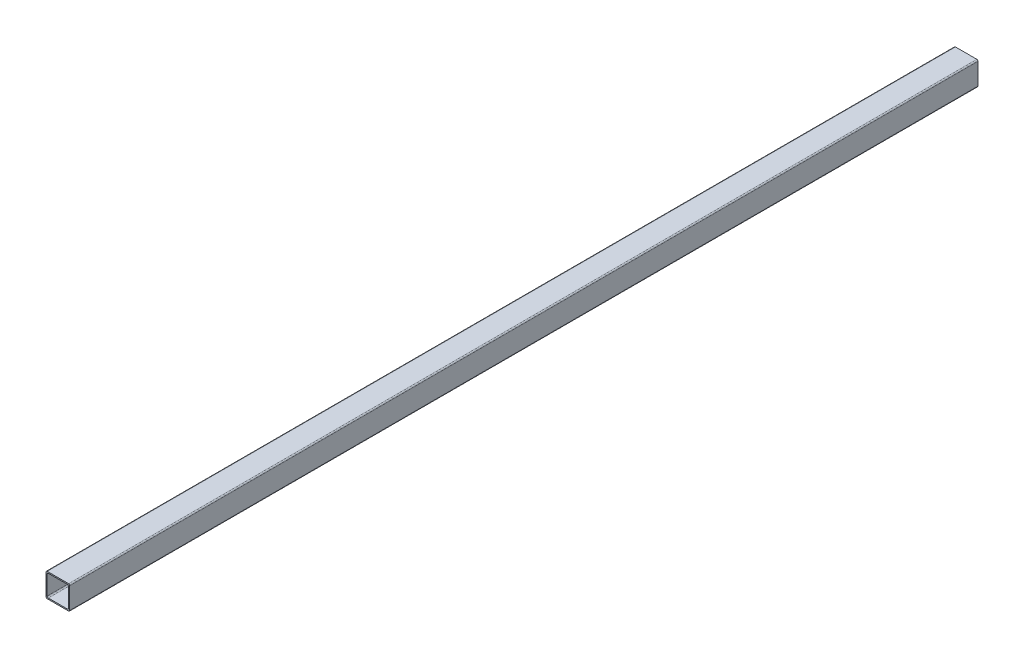
ISO-10303-21;
HEADER;
FILE_DESCRIPTION(('STEP AP214'),'2;1');
FILE_NAME('part.step','',(''),(''),'','','');
FILE_SCHEMA(('AUTOMOTIVE_DESIGN { 1 0 10303 214 1 1 1 1 }'));
ENDSEC;
DATA;
#1=APPLICATION_CONTEXT('core data for automotive mechanical design processes');
#2=APPLICATION_PROTOCOL_DEFINITION('international standard','automotive_design',2000,#1);
#3=PRODUCT_CONTEXT('',#1,'mechanical');
#4=PRODUCT('Part','Part','',(#3));
#5=PRODUCT_RELATED_PRODUCT_CATEGORY('part','',(#4));
#6=PRODUCT_DEFINITION_FORMATION('','',#4);
#7=PRODUCT_DEFINITION_CONTEXT('part definition',#1,'design');
#8=PRODUCT_DEFINITION('design','',#6,#7);
#9=PRODUCT_DEFINITION_SHAPE('','',#8);
#10=(LENGTH_UNIT() NAMED_UNIT(*) SI_UNIT(.MILLI.,.METRE.));
#11=(NAMED_UNIT(*) PLANE_ANGLE_UNIT() SI_UNIT($,.RADIAN.));
#12=(NAMED_UNIT(*) SI_UNIT($,.STERADIAN.) SOLID_ANGLE_UNIT());
#13=UNCERTAINTY_MEASURE_WITH_UNIT(LENGTH_MEASURE(1.E-05),#10,'distance_accuracy_value','');
#14=(GEOMETRIC_REPRESENTATION_CONTEXT(3) GLOBAL_UNCERTAINTY_ASSIGNED_CONTEXT((#13)) GLOBAL_UNIT_ASSIGNED_CONTEXT((#10,
#11,#12)) REPRESENTATION_CONTEXT('',''));
#15=CARTESIAN_POINT('',(0.,0.,0.));
#16=DIRECTION('',(0.,0.,1.));
#17=DIRECTION('',(1.,0.,0.));
#18=AXIS2_PLACEMENT_3D('',#15,#16,#17);
#19=CARTESIAN_POINT('',(18.,18.,1530.));
#20=DIRECTION('',(0.,0.,-1.));
#21=DIRECTION('',(-1.,0.,0.));
#22=AXIS2_PLACEMENT_3D('',#19,#20,#21);
#23=PLANE('',#22);
#24=CARTESIAN_POINT('',(18.,18.,1530.));
#25=DIRECTION('',(0.,0.,1.));
#26=DIRECTION('',(-1.,0.,0.));
#27=AXIS2_PLACEMENT_3D('',#24,#25,#26);
#28=CIRCLE('',#27,2.);
#29=CARTESIAN_POINT('',(20.,18.,1530.));
#30=VERTEX_POINT('',#29);
#31=CARTESIAN_POINT('',(18.,20.,1530.));
#32=VERTEX_POINT('',#31);
#33=EDGE_CURVE('E213',#30,#32,#28,.T.);
#34=ORIENTED_EDGE('',*,*,#33,.T.);
#35=DIRECTION('',(-1.,0.,0.));
#36=VECTOR('',#35,1.);
#37=CARTESIAN_POINT('',(-18.,20.,1530.));
#38=LINE('',#37,#36);
#39=CARTESIAN_POINT('',(-18.,20.,1530.));
#40=VERTEX_POINT('',#39);
#41=EDGE_CURVE('E216',#32,#40,#38,.T.);
#42=ORIENTED_EDGE('',*,*,#41,.T.);
#43=CARTESIAN_POINT('',(-18.,18.,1530.));
#44=DIRECTION('',(0.,0.,1.));
#45=DIRECTION('',(1.,0.,0.));
#46=AXIS2_PLACEMENT_3D('',#43,#44,#45);
#47=CIRCLE('',#46,2.);
#48=CARTESIAN_POINT('',(-20.,18.,1530.));
#49=VERTEX_POINT('',#48);
#50=EDGE_CURVE('E219',#40,#49,#47,.T.);
#51=ORIENTED_EDGE('',*,*,#50,.T.);
#52=DIRECTION('',(0.,-1.,0.));
#53=VECTOR('',#52,1.);
#54=CARTESIAN_POINT('',(-20.,18.,1530.));
#55=LINE('',#54,#53);
#56=CARTESIAN_POINT('',(-20.,-18.,1530.));
#57=VERTEX_POINT('',#56);
#58=EDGE_CURVE('E221',#49,#57,#55,.T.);
#59=ORIENTED_EDGE('',*,*,#58,.T.);
#60=CARTESIAN_POINT('',(-18.,-18.,1530.));
#61=DIRECTION('',(0.,0.,1.));
#62=DIRECTION('',(1.,0.,0.));
#63=AXIS2_PLACEMENT_3D('',#60,#61,#62);
#64=CIRCLE('',#63,2.);
#65=CARTESIAN_POINT('',(-18.,-20.,1530.));
#66=VERTEX_POINT('',#65);
#67=EDGE_CURVE('E223',#57,#66,#64,.T.);
#68=ORIENTED_EDGE('',*,*,#67,.T.);
#69=DIRECTION('',(1.,0.,0.));
#70=VECTOR('',#69,1.);
#71=CARTESIAN_POINT('',(-18.,-20.,1530.));
#72=LINE('',#71,#70);
#73=CARTESIAN_POINT('',(18.,-20.,1530.));
#74=VERTEX_POINT('',#73);
#75=EDGE_CURVE('E225',#66,#74,#72,.T.);
#76=ORIENTED_EDGE('',*,*,#75,.T.);
#77=CARTESIAN_POINT('',(18.,-18.,1530.));
#78=DIRECTION('',(0.,0.,1.));
#79=DIRECTION('',(1.,0.,0.));
#80=AXIS2_PLACEMENT_3D('',#77,#78,#79);
#81=CIRCLE('',#80,2.);
#82=CARTESIAN_POINT('',(20.,-18.,1530.));
#83=VERTEX_POINT('',#82);
#84=EDGE_CURVE('E227',#74,#83,#81,.T.);
#85=ORIENTED_EDGE('',*,*,#84,.T.);
#86=DIRECTION('',(0.,1.,0.));
#87=VECTOR('',#86,1.);
#88=CARTESIAN_POINT('',(20.,18.,1530.));
#89=LINE('',#88,#87);
#90=EDGE_CURVE('E229',#83,#30,#89,.T.);
#91=ORIENTED_EDGE('',*,*,#90,.T.);
#92=EDGE_LOOP('',(#34,#42,#51,#59,#68,#76,#85,#91));
#93=FACE_BOUND('',#92,.T.);
#94=CARTESIAN_POINT('',(16.,16.,1530.));
#95=DIRECTION('',(0.,0.,1.));
#96=DIRECTION('',(1.,0.,0.));
#97=AXIS2_PLACEMENT_3D('',#94,#95,#96);
#98=CIRCLE('',#97,2.);
#99=CARTESIAN_POINT('',(18.,16.,1530.));
#100=VERTEX_POINT('',#99);
#101=CARTESIAN_POINT('',(16.,18.,1530.));
#102=VERTEX_POINT('',#101);
#103=EDGE_CURVE('E148',#100,#102,#98,.T.);
#104=ORIENTED_EDGE('',*,*,#103,.F.);
#105=DIRECTION('',(0.,1.,0.));
#106=VECTOR('',#105,1.);
#107=CARTESIAN_POINT('',(18.,-16.,1530.));
#108=LINE('',#107,#106);
#109=CARTESIAN_POINT('',(18.,-16.,1530.));
#110=VERTEX_POINT('',#109);
#111=EDGE_CURVE('E181',#110,#100,#108,.T.);
#112=ORIENTED_EDGE('',*,*,#111,.F.);
#113=CARTESIAN_POINT('',(16.,-16.,1530.));
#114=DIRECTION('',(0.,0.,1.));
#115=DIRECTION('',(1.,0.,0.));
#116=AXIS2_PLACEMENT_3D('',#113,#114,#115);
#117=CIRCLE('',#116,2.);
#118=CARTESIAN_POINT('',(16.,-18.,1530.));
#119=VERTEX_POINT('',#118);
#120=EDGE_CURVE('E179',#119,#110,#117,.T.);
#121=ORIENTED_EDGE('',*,*,#120,.F.);
#122=DIRECTION('',(1.,0.,0.));
#123=VECTOR('',#122,1.);
#124=CARTESIAN_POINT('',(16.,-18.,1530.));
#125=LINE('',#124,#123);
#126=CARTESIAN_POINT('',(-16.,-18.,1530.));
#127=VERTEX_POINT('',#126);
#128=EDGE_CURVE('E177',#127,#119,#125,.T.);
#129=ORIENTED_EDGE('',*,*,#128,.F.);
#130=CARTESIAN_POINT('',(-16.,-16.,1530.));
#131=DIRECTION('',(0.,0.,1.));
#132=DIRECTION('',(-1.,0.,0.));
#133=AXIS2_PLACEMENT_3D('',#130,#131,#132);
#134=CIRCLE('',#133,2.);
#135=CARTESIAN_POINT('',(-18.,-16.,1530.));
#136=VERTEX_POINT('',#135);
#137=EDGE_CURVE('E175',#136,#127,#134,.T.);
#138=ORIENTED_EDGE('',*,*,#137,.F.);
#139=DIRECTION('',(0.,-1.,0.));
#140=VECTOR('',#139,1.);
#141=CARTESIAN_POINT('',(-18.,-16.,1530.));
#142=LINE('',#141,#140);
#143=CARTESIAN_POINT('',(-18.,16.,1530.));
#144=VERTEX_POINT('',#143);
#145=EDGE_CURVE('E171',#144,#136,#142,.T.);
#146=ORIENTED_EDGE('',*,*,#145,.F.);
#147=CARTESIAN_POINT('',(-16.,16.,1530.));
#148=DIRECTION('',(0.,0.,1.));
#149=DIRECTION('',(1.,0.,0.));
#150=AXIS2_PLACEMENT_3D('',#147,#148,#149);
#151=CIRCLE('',#150,2.);
#152=CARTESIAN_POINT('',(-16.,18.,1530.));
#153=VERTEX_POINT('',#152);
#154=EDGE_CURVE('E169',#153,#144,#151,.T.);
#155=ORIENTED_EDGE('',*,*,#154,.F.);
#156=DIRECTION('',(-1.,0.,0.));
#157=VECTOR('',#156,1.);
#158=CARTESIAN_POINT('',(16.,18.,1530.));
#159=LINE('',#158,#157);
#160=EDGE_CURVE('E156',#102,#153,#159,.T.);
#161=ORIENTED_EDGE('',*,*,#160,.F.);
#162=EDGE_LOOP('',(#104,#112,#121,#129,#138,#146,#155,#161));
#163=FACE_BOUND('',#162,.T.);
#164=ADVANCED_FACE('F35',(#93,#163),#23,.F.);
#165=CARTESIAN_POINT('',(18.,18.,0.));
#166=DIRECTION('',(0.,0.,-1.));
#167=DIRECTION('',(-1.,0.,0.));
#168=AXIS2_PLACEMENT_3D('',#165,#166,#167);
#169=PLANE('',#168);
#170=CARTESIAN_POINT('',(18.,18.,0.));
#171=DIRECTION('',(0.,0.,1.));
#172=DIRECTION('',(-1.,0.,0.));
#173=AXIS2_PLACEMENT_3D('',#170,#171,#172);
#174=CIRCLE('',#173,2.);
#175=CARTESIAN_POINT('',(20.,18.,0.));
#176=VERTEX_POINT('',#175);
#177=CARTESIAN_POINT('',(18.,20.,0.));
#178=VERTEX_POINT('',#177);
#179=EDGE_CURVE('E164',#176,#178,#174,.T.);
#180=ORIENTED_EDGE('',*,*,#179,.F.);
#181=DIRECTION('',(0.,1.,0.));
#182=VECTOR('',#181,1.);
#183=CARTESIAN_POINT('',(20.,18.,0.));
#184=LINE('',#183,#182);
#185=CARTESIAN_POINT('',(20.,-18.,0.));
#186=VERTEX_POINT('',#185);
#187=EDGE_CURVE('E217',#186,#176,#184,.T.);
#188=ORIENTED_EDGE('',*,*,#187,.F.);
#189=CARTESIAN_POINT('',(18.,-18.,0.));
#190=DIRECTION('',(0.,0.,1.));
#191=DIRECTION('',(1.,0.,0.));
#192=AXIS2_PLACEMENT_3D('',#189,#190,#191);
#193=CIRCLE('',#192,2.);
#194=CARTESIAN_POINT('',(18.,-20.,0.));
#195=VERTEX_POINT('',#194);
#196=EDGE_CURVE('E244',#195,#186,#193,.T.);
#197=ORIENTED_EDGE('',*,*,#196,.F.);
#198=DIRECTION('',(1.,0.,0.));
#199=VECTOR('',#198,1.);
#200=CARTESIAN_POINT('',(-18.,-20.,0.));
#201=LINE('',#200,#199);
#202=CARTESIAN_POINT('',(-18.,-20.,0.));
#203=VERTEX_POINT('',#202);
#204=EDGE_CURVE('E242',#203,#195,#201,.T.);
#205=ORIENTED_EDGE('',*,*,#204,.F.);
#206=CARTESIAN_POINT('',(-18.,-18.,0.));
#207=DIRECTION('',(0.,0.,1.));
#208=DIRECTION('',(1.,0.,0.));
#209=AXIS2_PLACEMENT_3D('',#206,#207,#208);
#210=CIRCLE('',#209,2.);
#211=CARTESIAN_POINT('',(-20.,-18.,0.));
#212=VERTEX_POINT('',#211);
#213=EDGE_CURVE('E240',#212,#203,#210,.T.);
#214=ORIENTED_EDGE('',*,*,#213,.F.);
#215=DIRECTION('',(0.,-1.,0.));
#216=VECTOR('',#215,1.);
#217=CARTESIAN_POINT('',(-20.,18.,0.));
#218=LINE('',#217,#216);
#219=CARTESIAN_POINT('',(-20.,18.,0.));
#220=VERTEX_POINT('',#219);
#221=EDGE_CURVE('E238',#220,#212,#218,.T.);
#222=ORIENTED_EDGE('',*,*,#221,.F.);
#223=CARTESIAN_POINT('',(-18.,18.,0.));
#224=DIRECTION('',(0.,0.,1.));
#225=DIRECTION('',(1.,0.,0.));
#226=AXIS2_PLACEMENT_3D('',#223,#224,#225);
#227=CIRCLE('',#226,2.);
#228=CARTESIAN_POINT('',(-18.,20.,0.));
#229=VERTEX_POINT('',#228);
#230=EDGE_CURVE('E236',#229,#220,#227,.T.);
#231=ORIENTED_EDGE('',*,*,#230,.F.);
#232=DIRECTION('',(-1.,0.,0.));
#233=VECTOR('',#232,1.);
#234=CARTESIAN_POINT('',(-18.,20.,0.));
#235=LINE('',#234,#233);
#236=EDGE_CURVE('E234',#178,#229,#235,.T.);
#237=ORIENTED_EDGE('',*,*,#236,.F.);
#238=EDGE_LOOP('',(#180,#188,#197,#205,#214,#222,#231,#237));
#239=FACE_BOUND('',#238,.T.);
#240=DIRECTION('',(0.,1.,0.));
#241=VECTOR('',#240,1.);
#242=CARTESIAN_POINT('',(18.,-16.,0.));
#243=LINE('',#242,#241);
#244=CARTESIAN_POINT('',(18.,-16.,0.));
#245=VERTEX_POINT('',#244);
#246=CARTESIAN_POINT('',(18.,16.,0.));
#247=VERTEX_POINT('',#246);
#248=EDGE_CURVE('E157',#245,#247,#243,.T.);
#249=ORIENTED_EDGE('',*,*,#248,.T.);
#250=CARTESIAN_POINT('',(16.,16.,0.));
#251=DIRECTION('',(0.,0.,1.));
#252=DIRECTION('',(1.,0.,0.));
#253=AXIS2_PLACEMENT_3D('',#250,#251,#252);
#254=CIRCLE('',#253,2.);
#255=CARTESIAN_POINT('',(16.,18.,0.));
#256=VERTEX_POINT('',#255);
#257=EDGE_CURVE('E58',#247,#256,#254,.T.);
#258=ORIENTED_EDGE('',*,*,#257,.T.);
#259=DIRECTION('',(-1.,0.,0.));
#260=VECTOR('',#259,1.);
#261=CARTESIAN_POINT('',(16.,18.,0.));
#262=LINE('',#261,#260);
#263=CARTESIAN_POINT('',(-16.,18.,0.));
#264=VERTEX_POINT('',#263);
#265=EDGE_CURVE('E163',#256,#264,#262,.T.);
#266=ORIENTED_EDGE('',*,*,#265,.T.);
#267=CARTESIAN_POINT('',(-16.,16.,0.));
#268=DIRECTION('',(0.,0.,1.));
#269=DIRECTION('',(1.,0.,0.));
#270=AXIS2_PLACEMENT_3D('',#267,#268,#269);
#271=CIRCLE('',#270,2.);
#272=CARTESIAN_POINT('',(-18.,16.,0.));
#273=VERTEX_POINT('',#272);
#274=EDGE_CURVE('E185',#264,#273,#271,.T.);
#275=ORIENTED_EDGE('',*,*,#274,.T.);
#276=DIRECTION('',(0.,-1.,0.));
#277=VECTOR('',#276,1.);
#278=CARTESIAN_POINT('',(-18.,-16.,0.));
#279=LINE('',#278,#277);
#280=CARTESIAN_POINT('',(-18.,-16.,0.));
#281=VERTEX_POINT('',#280);
#282=EDGE_CURVE('E188',#273,#281,#279,.T.);
#283=ORIENTED_EDGE('',*,*,#282,.T.);
#284=CARTESIAN_POINT('',(-16.,-16.,0.));
#285=DIRECTION('',(0.,0.,1.));
#286=DIRECTION('',(-1.,0.,0.));
#287=AXIS2_PLACEMENT_3D('',#284,#285,#286);
#288=CIRCLE('',#287,2.);
#289=CARTESIAN_POINT('',(-16.,-18.,0.));
#290=VERTEX_POINT('',#289);
#291=EDGE_CURVE('E191',#281,#290,#288,.T.);
#292=ORIENTED_EDGE('',*,*,#291,.T.);
#293=DIRECTION('',(1.,0.,0.));
#294=VECTOR('',#293,1.);
#295=CARTESIAN_POINT('',(16.,-18.,0.));
#296=LINE('',#295,#294);
#297=CARTESIAN_POINT('',(16.,-18.,0.));
#298=VERTEX_POINT('',#297);
#299=EDGE_CURVE('E194',#290,#298,#296,.T.);
#300=ORIENTED_EDGE('',*,*,#299,.T.);
#301=CARTESIAN_POINT('',(16.,-16.,0.));
#302=DIRECTION('',(0.,0.,1.));
#303=DIRECTION('',(1.,0.,0.));
#304=AXIS2_PLACEMENT_3D('',#301,#302,#303);
#305=CIRCLE('',#304,2.);
#306=EDGE_CURVE('E197',#298,#245,#305,.T.);
#307=ORIENTED_EDGE('',*,*,#306,.T.);
#308=EDGE_LOOP('',(#249,#258,#266,#275,#283,#292,#300,#307));
#309=FACE_BOUND('',#308,.T.);
#310=ADVANCED_FACE('F274',(#239,#309),#169,.T.);
#311=CARTESIAN_POINT('',(18.,18.,1530.));
#312=DIRECTION('',(0.,0.,-1.));
#313=DIRECTION('',(-1.,0.,0.));
#314=AXIS2_PLACEMENT_3D('',#311,#312,#313);
#315=CYLINDRICAL_SURFACE('',#314,2.);
#316=ORIENTED_EDGE('',*,*,#179,.T.);
#317=DIRECTION('',(0.,0.,-1.));
#318=VECTOR('',#317,1.);
#319=CARTESIAN_POINT('',(18.,20.,1530.));
#320=LINE('',#319,#318);
#321=EDGE_CURVE('E11',#32,#178,#320,.T.);
#322=ORIENTED_EDGE('',*,*,#321,.F.);
#323=ORIENTED_EDGE('',*,*,#33,.F.);
#324=DIRECTION('',(0.,0.,-1.));
#325=VECTOR('',#324,1.);
#326=CARTESIAN_POINT('',(20.,18.,1530.));
#327=LINE('',#326,#325);
#328=EDGE_CURVE('E231',#30,#176,#327,.T.);
#329=ORIENTED_EDGE('',*,*,#328,.T.);
#330=EDGE_LOOP('',(#316,#322,#323,#329));
#331=FACE_BOUND('',#330,.T.);
#332=ADVANCED_FACE('F37',(#331),#315,.T.);
#333=CARTESIAN_POINT('',(-18.,20.,1530.));
#334=DIRECTION('',(0.,-1.,0.));
#335=DIRECTION('',(0.,0.,-1.));
#336=AXIS2_PLACEMENT_3D('',#333,#334,#335);
#337=PLANE('',#336);
#338=ORIENTED_EDGE('',*,*,#236,.T.);
#339=DIRECTION('',(0.,0.,-1.));
#340=VECTOR('',#339,1.);
#341=CARTESIAN_POINT('',(-18.,20.,1530.));
#342=LINE('',#341,#340);
#343=EDGE_CURVE('E43',#40,#229,#342,.T.);
#344=ORIENTED_EDGE('',*,*,#343,.F.);
#345=ORIENTED_EDGE('',*,*,#41,.F.);
#346=ORIENTED_EDGE('',*,*,#321,.T.);
#347=EDGE_LOOP('',(#338,#344,#345,#346));
#348=FACE_BOUND('',#347,.T.);
#349=ADVANCED_FACE('F291',(#348),#337,.F.);
#350=CARTESIAN_POINT('',(-18.,18.,1530.));
#351=DIRECTION('',(0.,0.,-1.));
#352=DIRECTION('',(-1.,0.,0.));
#353=AXIS2_PLACEMENT_3D('',#350,#351,#352);
#354=CYLINDRICAL_SURFACE('',#353,2.);
#355=ORIENTED_EDGE('',*,*,#230,.T.);
#356=DIRECTION('',(0.,0.,-1.));
#357=VECTOR('',#356,1.);
#358=CARTESIAN_POINT('',(-20.,18.,1530.));
#359=LINE('',#358,#357);
#360=EDGE_CURVE('E261',#49,#220,#359,.T.);
#361=ORIENTED_EDGE('',*,*,#360,.F.);
#362=ORIENTED_EDGE('',*,*,#50,.F.);
#363=ORIENTED_EDGE('',*,*,#343,.T.);
#364=EDGE_LOOP('',(#355,#361,#362,#363));
#365=FACE_BOUND('',#364,.T.);
#366=ADVANCED_FACE('F268',(#365),#354,.T.);
#367=CARTESIAN_POINT('',(-20.,18.,1530.));
#368=DIRECTION('',(1.,0.,0.));
#369=DIRECTION('',(0.,0.,-1.));
#370=AXIS2_PLACEMENT_3D('',#367,#368,#369);
#371=PLANE('',#370);
#372=ORIENTED_EDGE('',*,*,#221,.T.);
#373=DIRECTION('',(0.,0.,-1.));
#374=VECTOR('',#373,1.);
#375=CARTESIAN_POINT('',(-20.,-18.,1530.));
#376=LINE('',#375,#374);
#377=EDGE_CURVE('E258',#57,#212,#376,.T.);
#378=ORIENTED_EDGE('',*,*,#377,.F.);
#379=ORIENTED_EDGE('',*,*,#58,.F.);
#380=ORIENTED_EDGE('',*,*,#360,.T.);
#381=EDGE_LOOP('',(#372,#378,#379,#380));
#382=FACE_BOUND('',#381,.T.);
#383=ADVANCED_FACE('F280',(#382),#371,.F.);
#384=CARTESIAN_POINT('',(-18.,-18.,1530.));
#385=DIRECTION('',(0.,0.,-1.));
#386=DIRECTION('',(-1.,0.,0.));
#387=AXIS2_PLACEMENT_3D('',#384,#385,#386);
#388=CYLINDRICAL_SURFACE('',#387,2.);
#389=ORIENTED_EDGE('',*,*,#213,.T.);
#390=DIRECTION('',(0.,0.,-1.));
#391=VECTOR('',#390,1.);
#392=CARTESIAN_POINT('',(-18.,-20.,1530.));
#393=LINE('',#392,#391);
#394=EDGE_CURVE('E255',#66,#203,#393,.T.);
#395=ORIENTED_EDGE('',*,*,#394,.F.);
#396=ORIENTED_EDGE('',*,*,#67,.F.);
#397=ORIENTED_EDGE('',*,*,#377,.T.);
#398=EDGE_LOOP('',(#389,#395,#396,#397));
#399=FACE_BOUND('',#398,.T.);
#400=ADVANCED_FACE('F284',(#399),#388,.T.);
#401=CARTESIAN_POINT('',(-18.,-20.,1530.));
#402=DIRECTION('',(0.,1.,0.));
#403=DIRECTION('',(0.,0.,1.));
#404=AXIS2_PLACEMENT_3D('',#401,#402,#403);
#405=PLANE('',#404);
#406=ORIENTED_EDGE('',*,*,#204,.T.);
#407=DIRECTION('',(0.,0.,-1.));
#408=VECTOR('',#407,1.);
#409=CARTESIAN_POINT('',(18.,-20.,1530.));
#410=LINE('',#409,#408);
#411=EDGE_CURVE('E252',#74,#195,#410,.T.);
#412=ORIENTED_EDGE('',*,*,#411,.F.);
#413=ORIENTED_EDGE('',*,*,#75,.F.);
#414=ORIENTED_EDGE('',*,*,#394,.T.);
#415=EDGE_LOOP('',(#406,#412,#413,#414));
#416=FACE_BOUND('',#415,.T.);
#417=ADVANCED_FACE('F304',(#416),#405,.F.);
#418=CARTESIAN_POINT('',(18.,-18.,1530.));
#419=DIRECTION('',(0.,0.,-1.));
#420=DIRECTION('',(-1.,0.,0.));
#421=AXIS2_PLACEMENT_3D('',#418,#419,#420);
#422=CYLINDRICAL_SURFACE('',#421,2.);
#423=ORIENTED_EDGE('',*,*,#196,.T.);
#424=DIRECTION('',(0.,0.,-1.));
#425=VECTOR('',#424,1.);
#426=CARTESIAN_POINT('',(20.,-18.,1530.));
#427=LINE('',#426,#425);
#428=EDGE_CURVE('E249',#83,#186,#427,.T.);
#429=ORIENTED_EDGE('',*,*,#428,.F.);
#430=ORIENTED_EDGE('',*,*,#84,.F.);
#431=ORIENTED_EDGE('',*,*,#411,.T.);
#432=EDGE_LOOP('',(#423,#429,#430,#431));
#433=FACE_BOUND('',#432,.T.);
#434=ADVANCED_FACE('F302',(#433),#422,.T.);
#435=CARTESIAN_POINT('',(20.,18.,1530.));
#436=DIRECTION('',(-1.,0.,0.));
#437=DIRECTION('',(0.,-1.,0.));
#438=AXIS2_PLACEMENT_3D('',#435,#436,#437);
#439=PLANE('',#438);
#440=ORIENTED_EDGE('',*,*,#187,.T.);
#441=ORIENTED_EDGE('',*,*,#328,.F.);
#442=ORIENTED_EDGE('',*,*,#90,.F.);
#443=ORIENTED_EDGE('',*,*,#428,.T.);
#444=EDGE_LOOP('',(#440,#441,#442,#443));
#445=FACE_BOUND('',#444,.T.);
#446=ADVANCED_FACE('F297',(#445),#439,.F.);
#447=CARTESIAN_POINT('',(16.,16.,1530.));
#448=DIRECTION('',(0.,0.,-1.));
#449=DIRECTION('',(-1.,0.,0.));
#450=AXIS2_PLACEMENT_3D('',#447,#448,#449);
#451=CYLINDRICAL_SURFACE('',#450,2.);
#452=ORIENTED_EDGE('',*,*,#257,.F.);
#453=DIRECTION('',(0.,0.,-1.));
#454=VECTOR('',#453,1.);
#455=CARTESIAN_POINT('',(18.,16.,1530.));
#456=LINE('',#455,#454);
#457=EDGE_CURVE('E152',#100,#247,#456,.T.);
#458=ORIENTED_EDGE('',*,*,#457,.F.);
#459=ORIENTED_EDGE('',*,*,#103,.T.);
#460=DIRECTION('',(0.,0.,-1.));
#461=VECTOR('',#460,1.);
#462=CARTESIAN_POINT('',(16.,18.,1530.));
#463=LINE('',#462,#461);
#464=EDGE_CURVE('E151',#102,#256,#463,.T.);
#465=ORIENTED_EDGE('',*,*,#464,.T.);
#466=EDGE_LOOP('',(#452,#458,#459,#465));
#467=FACE_BOUND('',#466,.T.);
#468=ADVANCED_FACE('F150',(#467),#451,.F.);
#469=CARTESIAN_POINT('',(16.,18.,1530.));
#470=DIRECTION('',(0.,-1.,0.));
#471=DIRECTION('',(0.,0.,-1.));
#472=AXIS2_PLACEMENT_3D('',#469,#470,#471);
#473=PLANE('',#472);
#474=ORIENTED_EDGE('',*,*,#265,.F.);
#475=ORIENTED_EDGE('',*,*,#464,.F.);
#476=ORIENTED_EDGE('',*,*,#160,.T.);
#477=DIRECTION('',(0.,0.,-1.));
#478=VECTOR('',#477,1.);
#479=CARTESIAN_POINT('',(-16.,18.,1530.));
#480=LINE('',#479,#478);
#481=EDGE_CURVE('E165',#153,#264,#480,.T.);
#482=ORIENTED_EDGE('',*,*,#481,.T.);
#483=EDGE_LOOP('',(#474,#475,#476,#482));
#484=FACE_BOUND('',#483,.T.);
#485=ADVANCED_FACE('F160',(#484),#473,.T.);
#486=CARTESIAN_POINT('',(-16.,16.,1530.));
#487=DIRECTION('',(0.,0.,-1.));
#488=DIRECTION('',(-1.,0.,0.));
#489=AXIS2_PLACEMENT_3D('',#486,#487,#488);
#490=CYLINDRICAL_SURFACE('',#489,2.);
#491=ORIENTED_EDGE('',*,*,#274,.F.);
#492=ORIENTED_EDGE('',*,*,#481,.F.);
#493=ORIENTED_EDGE('',*,*,#154,.T.);
#494=DIRECTION('',(0.,0.,-1.));
#495=VECTOR('',#494,1.);
#496=CARTESIAN_POINT('',(-18.,16.,1530.));
#497=LINE('',#496,#495);
#498=EDGE_CURVE('E210',#144,#273,#497,.T.);
#499=ORIENTED_EDGE('',*,*,#498,.T.);
#500=EDGE_LOOP('',(#491,#492,#493,#499));
#501=FACE_BOUND('',#500,.T.);
#502=ADVANCED_FACE('F329',(#501),#490,.F.);
#503=CARTESIAN_POINT('',(-18.,-16.,1530.));
#504=DIRECTION('',(1.,0.,0.));
#505=DIRECTION('',(0.,0.,-1.));
#506=AXIS2_PLACEMENT_3D('',#503,#504,#505);
#507=PLANE('',#506);
#508=ORIENTED_EDGE('',*,*,#282,.F.);
#509=ORIENTED_EDGE('',*,*,#498,.F.);
#510=ORIENTED_EDGE('',*,*,#145,.T.);
#511=DIRECTION('',(0.,0.,-1.));
#512=VECTOR('',#511,1.);
#513=CARTESIAN_POINT('',(-18.,-16.,1530.));
#514=LINE('',#513,#512);
#515=EDGE_CURVE('E208',#136,#281,#514,.T.);
#516=ORIENTED_EDGE('',*,*,#515,.T.);
#517=EDGE_LOOP('',(#508,#509,#510,#516));
#518=FACE_BOUND('',#517,.T.);
#519=ADVANCED_FACE('F333',(#518),#507,.T.);
#520=CARTESIAN_POINT('',(-16.,-16.,1530.));
#521=DIRECTION('',(0.,0.,-1.));
#522=DIRECTION('',(-1.,0.,0.));
#523=AXIS2_PLACEMENT_3D('',#520,#521,#522);
#524=CYLINDRICAL_SURFACE('',#523,2.);
#525=ORIENTED_EDGE('',*,*,#291,.F.);
#526=ORIENTED_EDGE('',*,*,#515,.F.);
#527=ORIENTED_EDGE('',*,*,#137,.T.);
#528=DIRECTION('',(0.,0.,-1.));
#529=VECTOR('',#528,1.);
#530=CARTESIAN_POINT('',(-16.,-18.,1530.));
#531=LINE('',#530,#529);
#532=EDGE_CURVE('E206',#127,#290,#531,.T.);
#533=ORIENTED_EDGE('',*,*,#532,.T.);
#534=EDGE_LOOP('',(#525,#526,#527,#533));
#535=FACE_BOUND('',#534,.T.);
#536=ADVANCED_FACE('F339',(#535),#524,.F.);
#537=CARTESIAN_POINT('',(16.,-18.,1530.));
#538=DIRECTION('',(0.,1.,0.));
#539=DIRECTION('',(0.,0.,1.));
#540=AXIS2_PLACEMENT_3D('',#537,#538,#539);
#541=PLANE('',#540);
#542=ORIENTED_EDGE('',*,*,#299,.F.);
#543=ORIENTED_EDGE('',*,*,#532,.F.);
#544=ORIENTED_EDGE('',*,*,#128,.T.);
#545=DIRECTION('',(0.,0.,-1.));
#546=VECTOR('',#545,1.);
#547=CARTESIAN_POINT('',(16.,-18.,1530.));
#548=LINE('',#547,#546);
#549=EDGE_CURVE('E204',#119,#298,#548,.T.);
#550=ORIENTED_EDGE('',*,*,#549,.T.);
#551=EDGE_LOOP('',(#542,#543,#544,#550));
#552=FACE_BOUND('',#551,.T.);
#553=ADVANCED_FACE('F343',(#552),#541,.T.);
#554=CARTESIAN_POINT('',(16.,-16.,1530.));
#555=DIRECTION('',(0.,0.,-1.));
#556=DIRECTION('',(-1.,0.,0.));
#557=AXIS2_PLACEMENT_3D('',#554,#555,#556);
#558=CYLINDRICAL_SURFACE('',#557,2.);
#559=ORIENTED_EDGE('',*,*,#306,.F.);
#560=ORIENTED_EDGE('',*,*,#549,.F.);
#561=ORIENTED_EDGE('',*,*,#120,.T.);
#562=DIRECTION('',(0.,0.,-1.));
#563=VECTOR('',#562,1.);
#564=CARTESIAN_POINT('',(18.,-16.,1530.));
#565=LINE('',#564,#563);
#566=EDGE_CURVE('E50',#110,#245,#565,.T.);
#567=ORIENTED_EDGE('',*,*,#566,.T.);
#568=EDGE_LOOP('',(#559,#560,#561,#567));
#569=FACE_BOUND('',#568,.T.);
#570=ADVANCED_FACE('F347',(#569),#558,.F.);
#571=CARTESIAN_POINT('',(18.,-16.,1530.));
#572=DIRECTION('',(-1.,0.,0.));
#573=DIRECTION('',(0.,0.,1.));
#574=AXIS2_PLACEMENT_3D('',#571,#572,#573);
#575=PLANE('',#574);
#576=ORIENTED_EDGE('',*,*,#248,.F.);
#577=ORIENTED_EDGE('',*,*,#566,.F.);
#578=ORIENTED_EDGE('',*,*,#111,.T.);
#579=ORIENTED_EDGE('',*,*,#457,.T.);
#580=EDGE_LOOP('',(#576,#577,#578,#579));
#581=FACE_BOUND('',#580,.T.);
#582=ADVANCED_FACE('F351',(#581),#575,.T.);
#583=CLOSED_SHELL('',(#164,#310,#332,#349,#366,#383,#400,#417,#434,#446,#468,#485,#502,#519,
#536,#553,#570,#582));
#584=MANIFOLD_SOLID_BREP('B2',#583);
#585=ADVANCED_BREP_SHAPE_REPRESENTATION('',(#18,#584),#14);
#586=SHAPE_DEFINITION_REPRESENTATION(#9,#585);
ENDSEC;
END-ISO-10303-21;
